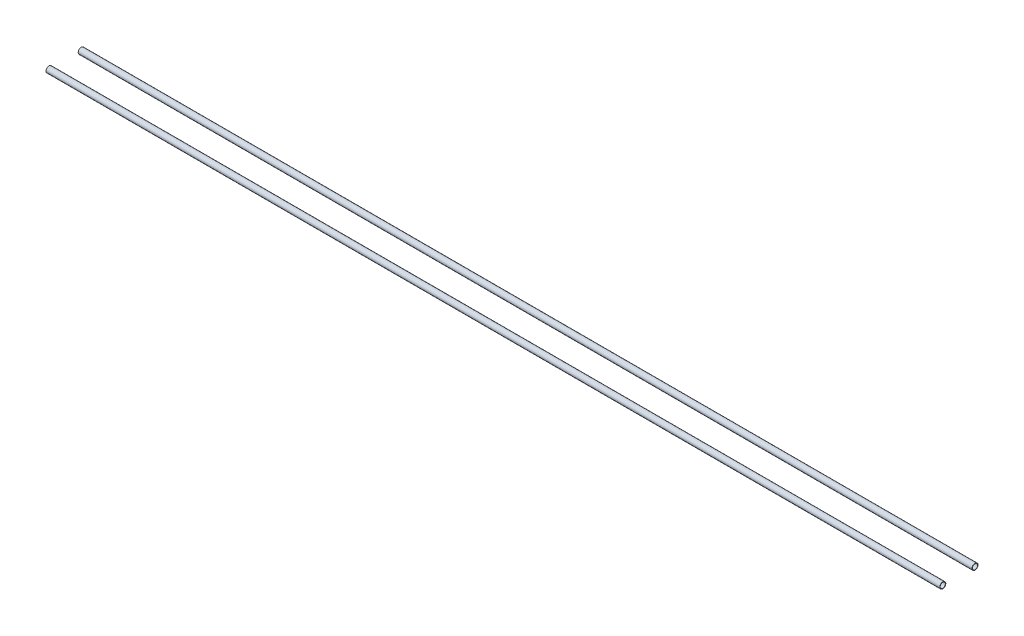
ISO-10303-21;
HEADER;
FILE_DESCRIPTION(('STEP AP214'),'2;1');
FILE_NAME('part.step','',(''),(''),'','','');
FILE_SCHEMA(('AUTOMOTIVE_DESIGN { 1 0 10303 214 1 1 1 1 }'));
ENDSEC;
DATA;
#1=APPLICATION_CONTEXT('core data for automotive mechanical design processes');
#2=APPLICATION_PROTOCOL_DEFINITION('international standard','automotive_design',2000,#1);
#3=PRODUCT_CONTEXT('',#1,'mechanical');
#4=PRODUCT('Part','Part','',(#3));
#5=PRODUCT_RELATED_PRODUCT_CATEGORY('part','',(#4));
#6=PRODUCT_DEFINITION_FORMATION('','',#4);
#7=PRODUCT_DEFINITION_CONTEXT('part definition',#1,'design');
#8=PRODUCT_DEFINITION('design','',#6,#7);
#9=PRODUCT_DEFINITION_SHAPE('','',#8);
#10=(LENGTH_UNIT() NAMED_UNIT(*) SI_UNIT(.MILLI.,.METRE.));
#11=(NAMED_UNIT(*) PLANE_ANGLE_UNIT() SI_UNIT($,.RADIAN.));
#12=(NAMED_UNIT(*) SI_UNIT($,.STERADIAN.) SOLID_ANGLE_UNIT());
#13=UNCERTAINTY_MEASURE_WITH_UNIT(LENGTH_MEASURE(1.E-05),#10,'distance_accuracy_value','');
#14=(GEOMETRIC_REPRESENTATION_CONTEXT(3) GLOBAL_UNCERTAINTY_ASSIGNED_CONTEXT((#13)) GLOBAL_UNIT_ASSIGNED_CONTEXT((#10,
#11,#12)) REPRESENTATION_CONTEXT('',''));
#15=CARTESIAN_POINT('',(0.,0.,0.));
#16=DIRECTION('',(0.,0.,1.));
#17=DIRECTION('',(1.,0.,0.));
#18=AXIS2_PLACEMENT_3D('',#15,#16,#17);
#19=CARTESIAN_POINT('',(1040.,0.,-75.));
#20=DIRECTION('',(1.,0.,0.));
#21=DIRECTION('',(0.,0.,-1.));
#22=AXIS2_PLACEMENT_3D('',#19,#20,#21);
#23=PLANE('',#22);
#24=CARTESIAN_POINT('',(1040.,0.,-75.));
#25=DIRECTION('',(1.,0.,0.));
#26=DIRECTION('',(0.,0.,-1.));
#27=AXIS2_PLACEMENT_3D('',#24,#25,#26);
#28=CIRCLE('',#27,7.);
#29=CARTESIAN_POINT('',(1040.,0.,-82.));
#30=VERTEX_POINT('',#29);
#31=EDGE_CURVE('E13',#30,#30,#28,.T.);
#32=ORIENTED_EDGE('',*,*,#31,.T.);
#33=EDGE_LOOP('',(#32));
#34=FACE_BOUND('',#33,.T.);
#35=CARTESIAN_POINT('',(1040.,0.,-75.));
#36=DIRECTION('',(1.,0.,0.));
#37=DIRECTION('',(0.,0.,-1.));
#38=AXIS2_PLACEMENT_3D('',#35,#36,#37);
#39=CIRCLE('',#38,6.);
#40=CARTESIAN_POINT('',(1040.,0.,-81.));
#41=VERTEX_POINT('',#40);
#42=EDGE_CURVE('E63',#41,#41,#39,.T.);
#43=ORIENTED_EDGE('',*,*,#42,.F.);
#44=EDGE_LOOP('',(#43));
#45=FACE_BOUND('',#44,.T.);
#46=ADVANCED_FACE('F52',(#34,#45),#23,.T.);
#47=CARTESIAN_POINT('',(-1040.,0.,-75.));
#48=DIRECTION('',(1.,0.,0.));
#49=DIRECTION('',(0.,0.,-1.));
#50=AXIS2_PLACEMENT_3D('',#47,#48,#49);
#51=PLANE('',#50);
#52=CARTESIAN_POINT('',(-1040.,0.,-75.));
#53=DIRECTION('',(1.,0.,0.));
#54=DIRECTION('',(0.,0.,-1.));
#55=AXIS2_PLACEMENT_3D('',#52,#53,#54);
#56=CIRCLE('',#55,7.);
#57=CARTESIAN_POINT('',(-1040.,0.,-82.));
#58=VERTEX_POINT('',#57);
#59=EDGE_CURVE('E56',#58,#58,#56,.T.);
#60=ORIENTED_EDGE('',*,*,#59,.F.);
#61=EDGE_LOOP('',(#60));
#62=FACE_BOUND('',#61,.T.);
#63=CARTESIAN_POINT('',(-1040.,0.,-75.));
#64=DIRECTION('',(1.,0.,0.));
#65=DIRECTION('',(0.,0.,-1.));
#66=AXIS2_PLACEMENT_3D('',#63,#64,#65);
#67=CIRCLE('',#66,6.);
#68=CARTESIAN_POINT('',(-1040.,0.,-81.));
#69=VERTEX_POINT('',#68);
#70=EDGE_CURVE('E65',#69,#69,#67,.T.);
#71=ORIENTED_EDGE('',*,*,#70,.T.);
#72=EDGE_LOOP('',(#71));
#73=FACE_BOUND('',#72,.T.);
#74=ADVANCED_FACE('F75',(#62,#73),#51,.F.);
#75=CARTESIAN_POINT('',(1040.,0.,-75.));
#76=DIRECTION('',(-1.,0.,0.));
#77=DIRECTION('',(0.,0.,1.));
#78=AXIS2_PLACEMENT_3D('',#75,#76,#77);
#79=CYLINDRICAL_SURFACE('',#78,7.);
#80=ORIENTED_EDGE('',*,*,#31,.F.);
#81=EDGE_LOOP('',(#80));
#82=FACE_BOUND('',#81,.T.);
#83=ORIENTED_EDGE('',*,*,#59,.T.);
#84=EDGE_LOOP('',(#83));
#85=FACE_BOUND('',#84,.T.);
#86=ADVANCED_FACE('F54',(#82,#85),#79,.T.);
#87=CARTESIAN_POINT('',(1040.,0.,-75.));
#88=DIRECTION('',(-1.,0.,0.));
#89=DIRECTION('',(0.,0.,1.));
#90=AXIS2_PLACEMENT_3D('',#87,#88,#89);
#91=CYLINDRICAL_SURFACE('',#90,6.);
#92=ORIENTED_EDGE('',*,*,#42,.T.);
#93=EDGE_LOOP('',(#92));
#94=FACE_BOUND('',#93,.T.);
#95=ORIENTED_EDGE('',*,*,#70,.F.);
#96=EDGE_LOOP('',(#95));
#97=FACE_BOUND('',#96,.T.);
#98=ADVANCED_FACE('F71',(#94,#97),#91,.F.);
#99=CLOSED_SHELL('',(#46,#74,#86,#98));
#100=MANIFOLD_SOLID_BREP('B2',#99);
#101=CARTESIAN_POINT('',(1040.,0.,0.));
#102=DIRECTION('',(1.,0.,0.));
#103=DIRECTION('',(0.,0.,-1.));
#104=AXIS2_PLACEMENT_3D('',#101,#102,#103);
#105=PLANE('',#104);
#106=CARTESIAN_POINT('',(1040.,0.,0.));
#107=DIRECTION('',(1.,0.,0.));
#108=DIRECTION('',(0.,0.,-1.));
#109=AXIS2_PLACEMENT_3D('',#106,#107,#108);
#110=CIRCLE('',#109,7.);
#111=CARTESIAN_POINT('',(1040.,0.,-7.));
#112=VERTEX_POINT('',#111);
#113=EDGE_CURVE('E51',#112,#112,#110,.T.);
#114=ORIENTED_EDGE('',*,*,#113,.T.);
#115=EDGE_LOOP('',(#114));
#116=FACE_BOUND('',#115,.T.);
#117=CARTESIAN_POINT('',(1040.,0.,0.));
#118=DIRECTION('',(1.,0.,0.));
#119=DIRECTION('',(0.,0.,-1.));
#120=AXIS2_PLACEMENT_3D('',#117,#118,#119);
#121=CIRCLE('',#120,6.);
#122=CARTESIAN_POINT('',(1040.,0.,-6.));
#123=VERTEX_POINT('',#122);
#124=EDGE_CURVE('E122',#123,#123,#121,.T.);
#125=ORIENTED_EDGE('',*,*,#124,.F.);
#126=EDGE_LOOP('',(#125));
#127=FACE_BOUND('',#126,.T.);
#128=ADVANCED_FACE('F111',(#116,#127),#105,.T.);
#129=CARTESIAN_POINT('',(-1040.,0.,0.));
#130=DIRECTION('',(1.,0.,0.));
#131=DIRECTION('',(0.,0.,-1.));
#132=AXIS2_PLACEMENT_3D('',#129,#130,#131);
#133=PLANE('',#132);
#134=CARTESIAN_POINT('',(-1040.,0.,0.));
#135=DIRECTION('',(1.,0.,0.));
#136=DIRECTION('',(0.,0.,-1.));
#137=AXIS2_PLACEMENT_3D('',#134,#135,#136);
#138=CIRCLE('',#137,7.);
#139=CARTESIAN_POINT('',(-1040.,0.,-7.));
#140=VERTEX_POINT('',#139);
#141=EDGE_CURVE('E115',#140,#140,#138,.T.);
#142=ORIENTED_EDGE('',*,*,#141,.F.);
#143=EDGE_LOOP('',(#142));
#144=FACE_BOUND('',#143,.T.);
#145=CARTESIAN_POINT('',(-1040.,0.,0.));
#146=DIRECTION('',(1.,0.,0.));
#147=DIRECTION('',(0.,0.,-1.));
#148=AXIS2_PLACEMENT_3D('',#145,#146,#147);
#149=CIRCLE('',#148,6.);
#150=CARTESIAN_POINT('',(-1040.,0.,-6.));
#151=VERTEX_POINT('',#150);
#152=EDGE_CURVE('E124',#151,#151,#149,.T.);
#153=ORIENTED_EDGE('',*,*,#152,.T.);
#154=EDGE_LOOP('',(#153));
#155=FACE_BOUND('',#154,.T.);
#156=ADVANCED_FACE('F134',(#144,#155),#133,.F.);
#157=CARTESIAN_POINT('',(1040.,0.,0.));
#158=DIRECTION('',(-1.,0.,0.));
#159=DIRECTION('',(0.,0.,1.));
#160=AXIS2_PLACEMENT_3D('',#157,#158,#159);
#161=CYLINDRICAL_SURFACE('',#160,7.);
#162=ORIENTED_EDGE('',*,*,#113,.F.);
#163=EDGE_LOOP('',(#162));
#164=FACE_BOUND('',#163,.T.);
#165=ORIENTED_EDGE('',*,*,#141,.T.);
#166=EDGE_LOOP('',(#165));
#167=FACE_BOUND('',#166,.T.);
#168=ADVANCED_FACE('F113',(#164,#167),#161,.T.);
#169=CARTESIAN_POINT('',(1040.,0.,0.));
#170=DIRECTION('',(-1.,0.,0.));
#171=DIRECTION('',(0.,0.,1.));
#172=AXIS2_PLACEMENT_3D('',#169,#170,#171);
#173=CYLINDRICAL_SURFACE('',#172,6.);
#174=ORIENTED_EDGE('',*,*,#124,.T.);
#175=EDGE_LOOP('',(#174));
#176=FACE_BOUND('',#175,.T.);
#177=ORIENTED_EDGE('',*,*,#152,.F.);
#178=EDGE_LOOP('',(#177));
#179=FACE_BOUND('',#178,.T.);
#180=ADVANCED_FACE('F130',(#176,#179),#173,.F.);
#181=CLOSED_SHELL('',(#128,#156,#168,#180));
#182=MANIFOLD_SOLID_BREP('B8',#181);
#183=ADVANCED_BREP_SHAPE_REPRESENTATION('',(#18,#100,#182),#14);
#184=SHAPE_DEFINITION_REPRESENTATION(#9,#183);
ENDSEC;
END-ISO-10303-21;
